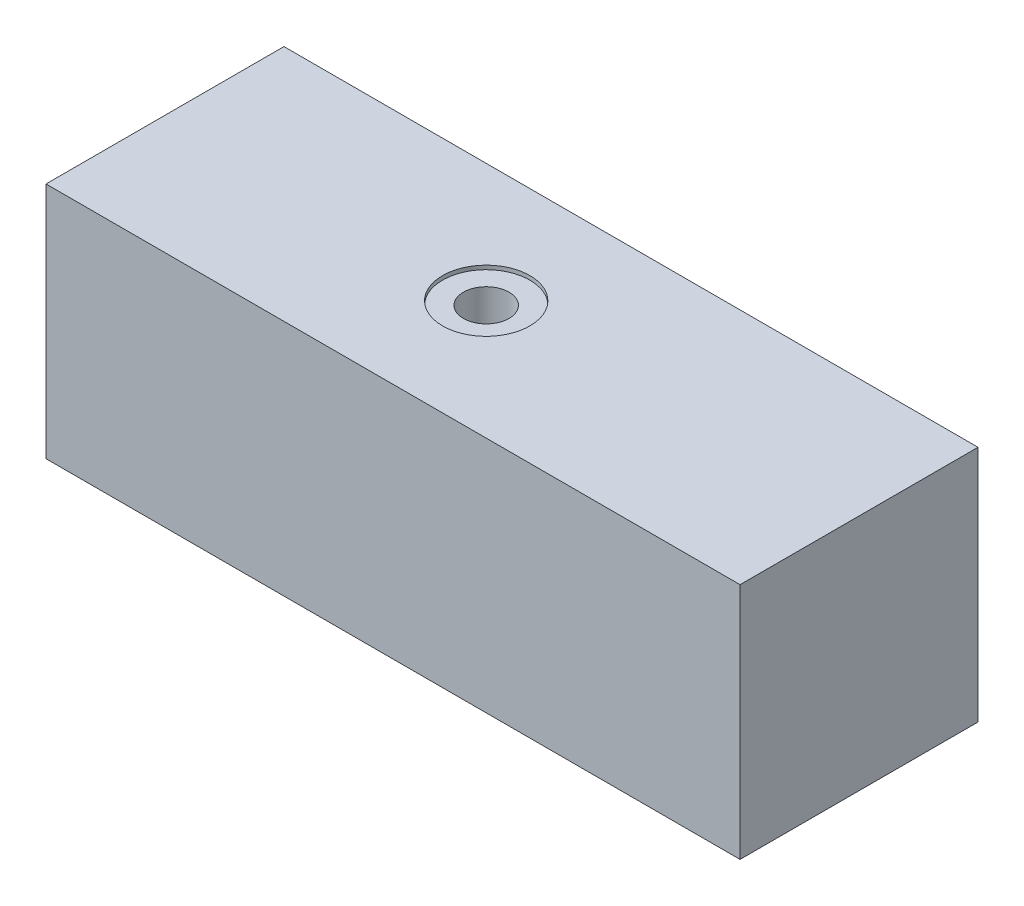
ISO-10303-21;
HEADER;
FILE_DESCRIPTION(('STEP AP214'),'2;1');
FILE_NAME('part.step','',(''),(''),'','','');
FILE_SCHEMA(('AUTOMOTIVE_DESIGN { 1 0 10303 214 1 1 1 1 }'));
ENDSEC;
DATA;
#1=APPLICATION_CONTEXT('core data for automotive mechanical design processes');
#2=APPLICATION_PROTOCOL_DEFINITION('international standard','automotive_design',2000,#1);
#3=PRODUCT_CONTEXT('',#1,'mechanical');
#4=PRODUCT('Part','Part','',(#3));
#5=PRODUCT_RELATED_PRODUCT_CATEGORY('part','',(#4));
#6=PRODUCT_DEFINITION_FORMATION('','',#4);
#7=PRODUCT_DEFINITION_CONTEXT('part definition',#1,'design');
#8=PRODUCT_DEFINITION('design','',#6,#7);
#9=PRODUCT_DEFINITION_SHAPE('','',#8);
#10=(LENGTH_UNIT() NAMED_UNIT(*) SI_UNIT(.MILLI.,.METRE.));
#11=(NAMED_UNIT(*) PLANE_ANGLE_UNIT() SI_UNIT($,.RADIAN.));
#12=(NAMED_UNIT(*) SI_UNIT($,.STERADIAN.) SOLID_ANGLE_UNIT());
#13=UNCERTAINTY_MEASURE_WITH_UNIT(LENGTH_MEASURE(1.E-05),#10,'distance_accuracy_value','');
#14=(GEOMETRIC_REPRESENTATION_CONTEXT(3) GLOBAL_UNCERTAINTY_ASSIGNED_CONTEXT((#13)) GLOBAL_UNIT_ASSIGNED_CONTEXT((#10,
#11,#12)) REPRESENTATION_CONTEXT('',''));
#15=CARTESIAN_POINT('',(0.,0.,0.));
#16=DIRECTION('',(0.,0.,1.));
#17=DIRECTION('',(1.,0.,0.));
#18=AXIS2_PLACEMENT_3D('',#15,#16,#17);
#19=CARTESIAN_POINT('',(87.5,34.,60.));
#20=DIRECTION('',(0.,-1.,0.));
#21=DIRECTION('',(1.,0.,0.));
#22=AXIS2_PLACEMENT_3D('',#19,#20,#21);
#23=PLANE('',#22);
#24=CARTESIAN_POINT('',(-6.49999999999999,34.,30.));
#25=DIRECTION('',(0.,1.,0.));
#26=DIRECTION('',(0.,0.,1.));
#27=AXIS2_PLACEMENT_3D('',#24,#25,#26);
#28=CIRCLE('',#27,11.);
#29=CARTESIAN_POINT('',(-6.49999999999999,34.,41.));
#30=VERTEX_POINT('',#29);
#31=EDGE_CURVE('E130',#30,#30,#28,.T.);
#32=ORIENTED_EDGE('',*,*,#31,.F.);
#33=EDGE_LOOP('',(#32));
#34=FACE_BOUND('',#33,.T.);
#35=DIRECTION('',(-1.,0.,0.));
#36=VECTOR('',#35,1.);
#37=CARTESIAN_POINT('',(87.5,34.,0.));
#38=LINE('',#37,#36);
#39=CARTESIAN_POINT('',(87.5,34.,0.));
#40=VERTEX_POINT('',#39);
#41=CARTESIAN_POINT('',(-87.5,34.,0.));
#42=VERTEX_POINT('',#41);
#43=EDGE_CURVE('E78',#40,#42,#38,.T.);
#44=ORIENTED_EDGE('',*,*,#43,.T.);
#45=DIRECTION('',(0.,0.,-1.));
#46=VECTOR('',#45,1.);
#47=CARTESIAN_POINT('',(-87.5,34.,60.));
#48=LINE('',#47,#46);
#49=CARTESIAN_POINT('',(-87.5,34.,60.));
#50=VERTEX_POINT('',#49);
#51=EDGE_CURVE('E11',#50,#42,#48,.T.);
#52=ORIENTED_EDGE('',*,*,#51,.F.);
#53=DIRECTION('',(-1.,0.,0.));
#54=VECTOR('',#53,1.);
#55=CARTESIAN_POINT('',(87.5,34.,60.));
#56=LINE('',#55,#54);
#57=CARTESIAN_POINT('',(87.5,34.,60.));
#58=VERTEX_POINT('',#57);
#59=EDGE_CURVE('E101',#58,#50,#56,.T.);
#60=ORIENTED_EDGE('',*,*,#59,.F.);
#61=DIRECTION('',(0.,0.,-1.));
#62=VECTOR('',#61,1.);
#63=CARTESIAN_POINT('',(87.5,34.,60.));
#64=LINE('',#63,#62);
#65=EDGE_CURVE('E90',#58,#40,#64,.T.);
#66=ORIENTED_EDGE('',*,*,#65,.T.);
#67=EDGE_LOOP('',(#44,#52,#60,#66));
#68=FACE_BOUND('',#67,.T.);
#69=ADVANCED_FACE('F34',(#34,#68),#23,.F.);
#70=CARTESIAN_POINT('',(-87.5,34.,60.));
#71=DIRECTION('',(1.,0.,0.));
#72=DIRECTION('',(0.,1.,0.));
#73=AXIS2_PLACEMENT_3D('',#70,#71,#72);
#74=PLANE('',#73);
#75=DIRECTION('',(0.,-1.,0.));
#76=VECTOR('',#75,1.);
#77=CARTESIAN_POINT('',(-87.5,34.,0.));
#78=LINE('',#77,#76);
#79=CARTESIAN_POINT('',(-87.5,-26.,0.));
#80=VERTEX_POINT('',#79);
#81=EDGE_CURVE('E74',#42,#80,#78,.T.);
#82=ORIENTED_EDGE('',*,*,#81,.T.);
#83=DIRECTION('',(0.,0.,-1.));
#84=VECTOR('',#83,1.);
#85=CARTESIAN_POINT('',(-87.5,-26.,60.));
#86=LINE('',#85,#84);
#87=CARTESIAN_POINT('',(-87.5,-26.,60.));
#88=VERTEX_POINT('',#87);
#89=EDGE_CURVE('E41',#88,#80,#86,.T.);
#90=ORIENTED_EDGE('',*,*,#89,.F.);
#91=DIRECTION('',(0.,-1.,0.));
#92=VECTOR('',#91,1.);
#93=CARTESIAN_POINT('',(-87.5,34.,60.));
#94=LINE('',#93,#92);
#95=EDGE_CURVE('E86',#50,#88,#94,.T.);
#96=ORIENTED_EDGE('',*,*,#95,.F.);
#97=ORIENTED_EDGE('',*,*,#51,.T.);
#98=EDGE_LOOP('',(#82,#90,#96,#97));
#99=FACE_BOUND('',#98,.T.);
#100=ADVANCED_FACE('F85',(#99),#74,.F.);
#101=CARTESIAN_POINT('',(-87.5,-26.,60.));
#102=DIRECTION('',(0.,1.,0.));
#103=DIRECTION('',(0.,0.,1.));
#104=AXIS2_PLACEMENT_3D('',#101,#102,#103);
#105=PLANE('',#104);
#106=CARTESIAN_POINT('',(-6.49999999999999,-26.,30.));
#107=DIRECTION('',(0.,1.,0.));
#108=DIRECTION('',(0.,0.,1.));
#109=AXIS2_PLACEMENT_3D('',#106,#107,#108);
#110=CIRCLE('',#109,5.75000000000001);
#111=CARTESIAN_POINT('',(-6.49999999999999,-26.,35.75));
#112=VERTEX_POINT('',#111);
#113=EDGE_CURVE('E91',#112,#112,#110,.T.);
#114=ORIENTED_EDGE('',*,*,#113,.T.);
#115=EDGE_LOOP('',(#114));
#116=FACE_BOUND('',#115,.T.);
#117=DIRECTION('',(1.,0.,0.));
#118=VECTOR('',#117,1.);
#119=CARTESIAN_POINT('',(-87.5,-26.,0.));
#120=LINE('',#119,#118);
#121=CARTESIAN_POINT('',(87.5,-26.,0.));
#122=VERTEX_POINT('',#121);
#123=EDGE_CURVE('E79',#80,#122,#120,.T.);
#124=ORIENTED_EDGE('',*,*,#123,.T.);
#125=DIRECTION('',(0.,0.,-1.));
#126=VECTOR('',#125,1.);
#127=CARTESIAN_POINT('',(87.5,-26.,60.));
#128=LINE('',#127,#126);
#129=CARTESIAN_POINT('',(87.5,-26.,60.));
#130=VERTEX_POINT('',#129);
#131=EDGE_CURVE('E107',#130,#122,#128,.T.);
#132=ORIENTED_EDGE('',*,*,#131,.F.);
#133=DIRECTION('',(1.,0.,0.));
#134=VECTOR('',#133,1.);
#135=CARTESIAN_POINT('',(-87.5,-26.,60.));
#136=LINE('',#135,#134);
#137=EDGE_CURVE('E53',#88,#130,#136,.T.);
#138=ORIENTED_EDGE('',*,*,#137,.F.);
#139=ORIENTED_EDGE('',*,*,#89,.T.);
#140=EDGE_LOOP('',(#124,#132,#138,#139));
#141=FACE_BOUND('',#140,.T.);
#142=ADVANCED_FACE('F110',(#116,#141),#105,.F.);
#143=CARTESIAN_POINT('',(87.5,-26.,60.));
#144=DIRECTION('',(-1.,0.,0.));
#145=DIRECTION('',(0.,0.,1.));
#146=AXIS2_PLACEMENT_3D('',#143,#144,#145);
#147=PLANE('',#146);
#148=DIRECTION('',(0.,1.,0.));
#149=VECTOR('',#148,1.);
#150=CARTESIAN_POINT('',(87.5,-26.,0.));
#151=LINE('',#150,#149);
#152=EDGE_CURVE('E99',#122,#40,#151,.T.);
#153=ORIENTED_EDGE('',*,*,#152,.T.);
#154=ORIENTED_EDGE('',*,*,#65,.F.);
#155=DIRECTION('',(0.,1.,0.));
#156=VECTOR('',#155,1.);
#157=CARTESIAN_POINT('',(87.5,-26.,60.));
#158=LINE('',#157,#156);
#159=EDGE_CURVE('E48',#130,#58,#158,.T.);
#160=ORIENTED_EDGE('',*,*,#159,.F.);
#161=ORIENTED_EDGE('',*,*,#131,.T.);
#162=EDGE_LOOP('',(#153,#154,#160,#161));
#163=FACE_BOUND('',#162,.T.);
#164=ADVANCED_FACE('F112',(#163),#147,.F.);
#165=CARTESIAN_POINT('',(-87.5,34.,60.));
#166=DIRECTION('',(0.,0.,1.));
#167=DIRECTION('',(1.,0.,0.));
#168=AXIS2_PLACEMENT_3D('',#165,#166,#167);
#169=PLANE('',#168);
#170=ORIENTED_EDGE('',*,*,#59,.T.);
#171=ORIENTED_EDGE('',*,*,#95,.T.);
#172=ORIENTED_EDGE('',*,*,#137,.T.);
#173=ORIENTED_EDGE('',*,*,#159,.T.);
#174=EDGE_LOOP('',(#170,#171,#172,#173));
#175=FACE_BOUND('',#174,.T.);
#176=ADVANCED_FACE('F113',(#175),#169,.T.);
#177=CARTESIAN_POINT('',(-87.5,34.,0.));
#178=DIRECTION('',(0.,0.,1.));
#179=DIRECTION('',(1.,0.,0.));
#180=AXIS2_PLACEMENT_3D('',#177,#178,#179);
#181=PLANE('',#180);
#182=ORIENTED_EDGE('',*,*,#43,.F.);
#183=ORIENTED_EDGE('',*,*,#152,.F.);
#184=ORIENTED_EDGE('',*,*,#123,.F.);
#185=ORIENTED_EDGE('',*,*,#81,.F.);
#186=EDGE_LOOP('',(#182,#183,#184,#185));
#187=FACE_BOUND('',#186,.T.);
#188=ADVANCED_FACE('F75',(#187),#181,.F.);
#189=CARTESIAN_POINT('',(-6.49999999999999,34.,30.));
#190=DIRECTION('',(0.,1.,0.));
#191=DIRECTION('',(0.,0.,1.));
#192=AXIS2_PLACEMENT_3D('',#189,#190,#191);
#193=CYLINDRICAL_SURFACE('',#192,5.75000000000001);
#194=ORIENTED_EDGE('',*,*,#113,.F.);
#195=EDGE_LOOP('',(#194));
#196=FACE_BOUND('',#195,.T.);
#197=CARTESIAN_POINT('',(-6.49999999999999,33.,30.));
#198=DIRECTION('',(0.,1.,0.));
#199=DIRECTION('',(0.,0.,1.));
#200=AXIS2_PLACEMENT_3D('',#197,#198,#199);
#201=CIRCLE('',#200,5.75000000000001);
#202=CARTESIAN_POINT('',(-6.49999999999999,33.,35.75));
#203=VERTEX_POINT('',#202);
#204=EDGE_CURVE('E94',#203,#203,#201,.T.);
#205=ORIENTED_EDGE('',*,*,#204,.T.);
#206=EDGE_LOOP('',(#205));
#207=FACE_BOUND('',#206,.T.);
#208=ADVANCED_FACE('F120',(#196,#207),#193,.F.);
#209=CARTESIAN_POINT('',(-0.749999999999978,33.,30.));
#210=DIRECTION('',(0.,-1.,0.));
#211=DIRECTION('',(0.,0.,-1.));
#212=AXIS2_PLACEMENT_3D('',#209,#210,#211);
#213=PLANE('',#212);
#214=ORIENTED_EDGE('',*,*,#204,.F.);
#215=EDGE_LOOP('',(#214));
#216=FACE_BOUND('',#215,.T.);
#217=CARTESIAN_POINT('',(-6.49999999999999,33.,30.));
#218=DIRECTION('',(0.,1.,0.));
#219=DIRECTION('',(0.,0.,1.));
#220=AXIS2_PLACEMENT_3D('',#217,#218,#219);
#221=CIRCLE('',#220,11.);
#222=CARTESIAN_POINT('',(-6.49999999999999,33.,41.));
#223=VERTEX_POINT('',#222);
#224=EDGE_CURVE('E132',#223,#223,#221,.T.);
#225=ORIENTED_EDGE('',*,*,#224,.T.);
#226=EDGE_LOOP('',(#225));
#227=FACE_BOUND('',#226,.T.);
#228=ADVANCED_FACE('F140',(#216,#227),#213,.F.);
#229=CARTESIAN_POINT('',(-6.49999999999999,34.,30.));
#230=DIRECTION('',(0.,1.,0.));
#231=DIRECTION('',(0.,0.,1.));
#232=AXIS2_PLACEMENT_3D('',#229,#230,#231);
#233=CYLINDRICAL_SURFACE('',#232,11.);
#234=ORIENTED_EDGE('',*,*,#224,.F.);
#235=EDGE_LOOP('',(#234));
#236=FACE_BOUND('',#235,.T.);
#237=ORIENTED_EDGE('',*,*,#31,.T.);
#238=EDGE_LOOP('',(#237));
#239=FACE_BOUND('',#238,.T.);
#240=ADVANCED_FACE('F143',(#236,#239),#233,.F.);
#241=CLOSED_SHELL('',(#69,#100,#142,#164,#176,#188,#208,#228,#240));
#242=MANIFOLD_SOLID_BREP('B2',#241);
#243=ADVANCED_BREP_SHAPE_REPRESENTATION('',(#18,#242),#14);
#244=SHAPE_DEFINITION_REPRESENTATION(#9,#243);
ENDSEC;
END-ISO-10303-21;
